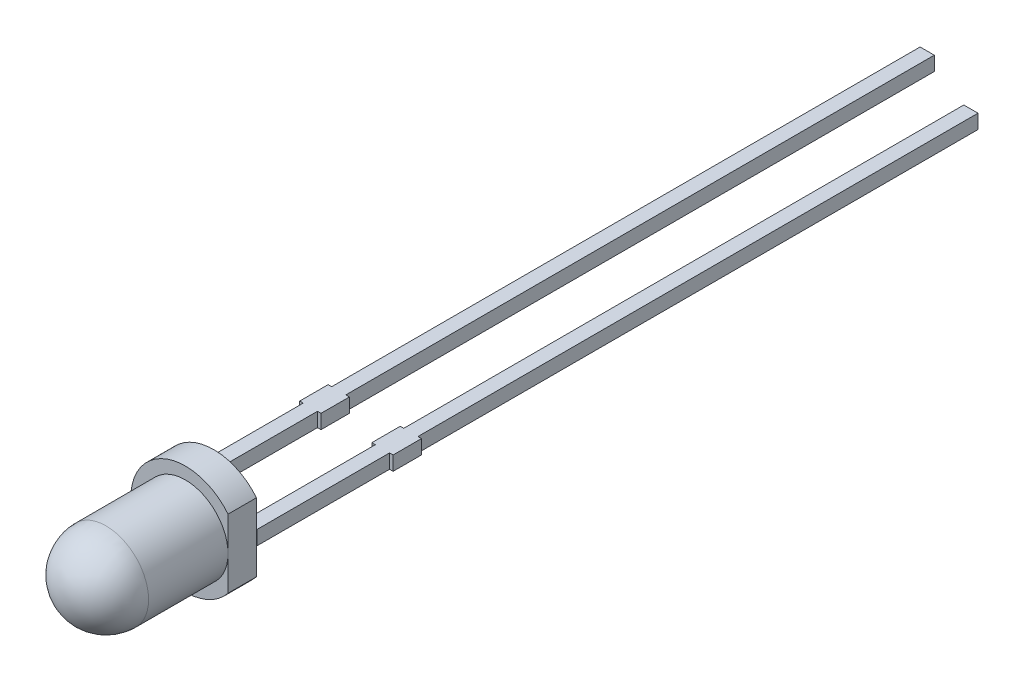
ISO-10303-21;
HEADER;
FILE_DESCRIPTION(('STEP AP214'),'2;1');
FILE_NAME('part.step','',(''),(''),'','','');
FILE_SCHEMA(('AUTOMOTIVE_DESIGN { 1 0 10303 214 1 1 1 1 }'));
ENDSEC;
DATA;
#1=APPLICATION_CONTEXT('core data for automotive mechanical design processes');
#2=APPLICATION_PROTOCOL_DEFINITION('international standard','automotive_design',2000,#1);
#3=PRODUCT_CONTEXT('',#1,'mechanical');
#4=PRODUCT('Part','Part','',(#3));
#5=PRODUCT_RELATED_PRODUCT_CATEGORY('part','',(#4));
#6=PRODUCT_DEFINITION_FORMATION('','',#4);
#7=PRODUCT_DEFINITION_CONTEXT('part definition',#1,'design');
#8=PRODUCT_DEFINITION('design','',#6,#7);
#9=PRODUCT_DEFINITION_SHAPE('','',#8);
#10=(LENGTH_UNIT() NAMED_UNIT(*) SI_UNIT(.MILLI.,.METRE.));
#11=(NAMED_UNIT(*) PLANE_ANGLE_UNIT() SI_UNIT($,.RADIAN.));
#12=(NAMED_UNIT(*) SI_UNIT($,.STERADIAN.) SOLID_ANGLE_UNIT());
#13=UNCERTAINTY_MEASURE_WITH_UNIT(LENGTH_MEASURE(1.E-05),#10,'distance_accuracy_value','');
#14=(GEOMETRIC_REPRESENTATION_CONTEXT(3) GLOBAL_UNCERTAINTY_ASSIGNED_CONTEXT((#13)) GLOBAL_UNIT_ASSIGNED_CONTEXT((#10,
#11,#12)) REPRESENTATION_CONTEXT('',''));
#15=CARTESIAN_POINT('',(0.,0.,0.));
#16=DIRECTION('',(0.,0.,1.));
#17=DIRECTION('',(1.,0.,0.));
#18=AXIS2_PLACEMENT_3D('',#15,#16,#17);
#19=CARTESIAN_POINT('',(-1.52,-0.25,-26.4));
#20=DIRECTION('',(0.,-1.,0.));
#21=DIRECTION('',(0.,0.,-1.));
#22=AXIS2_PLACEMENT_3D('',#19,#20,#21);
#23=PLANE('',#22);
#24=DIRECTION('',(0.,0.,-1.));
#25=VECTOR('',#24,1.);
#26=CARTESIAN_POINT('',(-1.02,-0.25,-26.4));
#27=LINE('',#26,#25);
#28=CARTESIAN_POINT('',(-1.02,-0.25,0.));
#29=VERTEX_POINT('',#28);
#30=CARTESIAN_POINT('',(-1.02,-0.25,-4.67));
#31=VERTEX_POINT('',#30);
#32=EDGE_CURVE('E238',#29,#31,#27,.T.);
#33=ORIENTED_EDGE('',*,*,#32,.F.);
#34=DIRECTION('',(1.,0.,0.));
#35=VECTOR('',#34,1.);
#36=CARTESIAN_POINT('',(-1.52,-0.25,0.));
#37=LINE('',#36,#35);
#38=CARTESIAN_POINT('',(-1.52,-0.25,0.));
#39=VERTEX_POINT('',#38);
#40=EDGE_CURVE('E220',#29,#39,#37,.F.);
#41=ORIENTED_EDGE('',*,*,#40,.T.);
#42=DIRECTION('',(0.,0.,1.));
#43=VECTOR('',#42,1.);
#44=CARTESIAN_POINT('',(-1.52,-0.25,-26.4));
#45=LINE('',#44,#43);
#46=CARTESIAN_POINT('',(-1.52,-0.25,-4.67));
#47=VERTEX_POINT('',#46);
#48=EDGE_CURVE('E404',#47,#39,#45,.T.);
#49=ORIENTED_EDGE('',*,*,#48,.F.);
#50=DIRECTION('',(-1.,0.,0.));
#51=VECTOR('',#50,1.);
#52=CARTESIAN_POINT('',(-0.895,-0.25,-4.67));
#53=LINE('',#52,#51);
#54=CARTESIAN_POINT('',(-1.645,-0.25,-4.67));
#55=VERTEX_POINT('',#54);
#56=EDGE_CURVE('E412',#47,#55,#53,.T.);
#57=ORIENTED_EDGE('',*,*,#56,.T.);
#58=DIRECTION('',(0.,0.,-1.));
#59=VECTOR('',#58,1.);
#60=CARTESIAN_POINT('',(-1.645,-0.25,-4.67));
#61=LINE('',#60,#59);
#62=CARTESIAN_POINT('',(-1.645,-0.25,-5.67));
#63=VERTEX_POINT('',#62);
#64=EDGE_CURVE('E416',#55,#63,#61,.T.);
#65=ORIENTED_EDGE('',*,*,#64,.T.);
#66=DIRECTION('',(1.,0.,0.));
#67=VECTOR('',#66,1.);
#68=CARTESIAN_POINT('',(-1.645,-0.25,-5.67));
#69=LINE('',#68,#67);
#70=CARTESIAN_POINT('',(-1.52,-0.25,-5.67));
#71=VERTEX_POINT('',#70);
#72=EDGE_CURVE('E420',#63,#71,#69,.T.);
#73=ORIENTED_EDGE('',*,*,#72,.T.);
#74=DIRECTION('',(0.,0.,1.));
#75=VECTOR('',#74,1.);
#76=CARTESIAN_POINT('',(-1.52,-0.25,-26.4));
#77=LINE('',#76,#75);
#78=CARTESIAN_POINT('',(-1.52,-0.25,-26.4));
#79=VERTEX_POINT('',#78);
#80=EDGE_CURVE('E425',#79,#71,#77,.T.);
#81=ORIENTED_EDGE('',*,*,#80,.F.);
#82=DIRECTION('',(1.,0.,0.));
#83=VECTOR('',#82,1.);
#84=CARTESIAN_POINT('',(-1.52,-0.25,-26.4));
#85=LINE('',#84,#83);
#86=CARTESIAN_POINT('',(-1.02,-0.25,-26.4));
#87=VERTEX_POINT('',#86);
#88=EDGE_CURVE('E430',#79,#87,#85,.T.);
#89=ORIENTED_EDGE('',*,*,#88,.T.);
#90=DIRECTION('',(0.,0.,-1.));
#91=VECTOR('',#90,1.);
#92=CARTESIAN_POINT('',(-1.02,-0.25,-26.4));
#93=LINE('',#92,#91);
#94=CARTESIAN_POINT('',(-1.02,-0.25,-5.67));
#95=VERTEX_POINT('',#94);
#96=EDGE_CURVE('E432',#95,#87,#93,.T.);
#97=ORIENTED_EDGE('',*,*,#96,.F.);
#98=DIRECTION('',(1.,0.,0.));
#99=VECTOR('',#98,1.);
#100=CARTESIAN_POINT('',(-1.645,-0.25,-5.67));
#101=LINE('',#100,#99);
#102=CARTESIAN_POINT('',(-0.895,-0.25,-5.67));
#103=VERTEX_POINT('',#102);
#104=EDGE_CURVE('E440',#95,#103,#101,.T.);
#105=ORIENTED_EDGE('',*,*,#104,.T.);
#106=DIRECTION('',(0.,0.,1.));
#107=VECTOR('',#106,1.);
#108=CARTESIAN_POINT('',(-0.895,-0.25,-5.67));
#109=LINE('',#108,#107);
#110=CARTESIAN_POINT('',(-0.895,-0.25,-4.67));
#111=VERTEX_POINT('',#110);
#112=EDGE_CURVE('E444',#103,#111,#109,.T.);
#113=ORIENTED_EDGE('',*,*,#112,.T.);
#114=DIRECTION('',(-1.,0.,0.));
#115=VECTOR('',#114,1.);
#116=CARTESIAN_POINT('',(-0.895,-0.25,-4.67));
#117=LINE('',#116,#115);
#118=EDGE_CURVE('E448',#111,#31,#117,.T.);
#119=ORIENTED_EDGE('',*,*,#118,.T.);
#120=EDGE_LOOP('',(#33,#41,#49,#57,#65,#73,#81,#89,#97,#105,#113,#119));
#121=FACE_BOUND('',#120,.T.);
#122=ADVANCED_FACE('F16',(#121),#23,.T.);
#123=CARTESIAN_POINT('',(1.52,-0.25,-26.4));
#124=DIRECTION('',(0.,1.,0.));
#125=DIRECTION('',(0.,0.,1.));
#126=AXIS2_PLACEMENT_3D('',#123,#124,#125);
#127=PLANE('',#126);
#128=DIRECTION('',(1.,0.,0.));
#129=VECTOR('',#128,1.);
#130=CARTESIAN_POINT('',(0.895,-0.25,-4.67));
#131=LINE('',#130,#129);
#132=CARTESIAN_POINT('',(0.895,-0.25,-4.67));
#133=VERTEX_POINT('',#132);
#134=CARTESIAN_POINT('',(1.02,-0.25,-4.67));
#135=VERTEX_POINT('',#134);
#136=EDGE_CURVE('E389',#133,#135,#131,.T.);
#137=ORIENTED_EDGE('',*,*,#136,.F.);
#138=DIRECTION('',(0.,0.,1.));
#139=VECTOR('',#138,1.);
#140=CARTESIAN_POINT('',(0.895,-0.25,-5.67));
#141=LINE('',#140,#139);
#142=CARTESIAN_POINT('',(0.895,-0.25,-5.67));
#143=VERTEX_POINT('',#142);
#144=EDGE_CURVE('E386',#143,#133,#141,.T.);
#145=ORIENTED_EDGE('',*,*,#144,.F.);
#146=DIRECTION('',(-1.,0.,0.));
#147=VECTOR('',#146,1.);
#148=CARTESIAN_POINT('',(1.645,-0.25,-5.67));
#149=LINE('',#148,#147);
#150=CARTESIAN_POINT('',(1.02,-0.25,-5.67));
#151=VERTEX_POINT('',#150);
#152=EDGE_CURVE('E380',#151,#143,#149,.T.);
#153=ORIENTED_EDGE('',*,*,#152,.F.);
#154=DIRECTION('',(0.,0.,-1.));
#155=VECTOR('',#154,1.);
#156=CARTESIAN_POINT('',(1.02,-0.25,-26.4));
#157=LINE('',#156,#155);
#158=CARTESIAN_POINT('',(1.02,-0.25,-25.4));
#159=VERTEX_POINT('',#158);
#160=EDGE_CURVE('E372',#151,#159,#157,.T.);
#161=ORIENTED_EDGE('',*,*,#160,.T.);
#162=DIRECTION('',(-1.,0.,0.));
#163=VECTOR('',#162,1.);
#164=CARTESIAN_POINT('',(1.52,-0.25,-25.4));
#165=LINE('',#164,#163);
#166=CARTESIAN_POINT('',(1.52,-0.25,-25.4));
#167=VERTEX_POINT('',#166);
#168=EDGE_CURVE('E369',#167,#159,#165,.T.);
#169=ORIENTED_EDGE('',*,*,#168,.F.);
#170=DIRECTION('',(0.,0.,1.));
#171=VECTOR('',#170,1.);
#172=CARTESIAN_POINT('',(1.52,-0.25,-26.4));
#173=LINE('',#172,#171);
#174=CARTESIAN_POINT('',(1.52,-0.25,-5.67));
#175=VERTEX_POINT('',#174);
#176=EDGE_CURVE('E361',#167,#175,#173,.T.);
#177=ORIENTED_EDGE('',*,*,#176,.T.);
#178=DIRECTION('',(-1.,0.,0.));
#179=VECTOR('',#178,1.);
#180=CARTESIAN_POINT('',(1.645,-0.25,-5.67));
#181=LINE('',#180,#179);
#182=CARTESIAN_POINT('',(1.645,-0.25,-5.67));
#183=VERTEX_POINT('',#182);
#184=EDGE_CURVE('E355',#183,#175,#181,.T.);
#185=ORIENTED_EDGE('',*,*,#184,.F.);
#186=DIRECTION('',(0.,0.,-1.));
#187=VECTOR('',#186,1.);
#188=CARTESIAN_POINT('',(1.645,-0.25,-4.67));
#189=LINE('',#188,#187);
#190=CARTESIAN_POINT('',(1.645,-0.25,-4.67));
#191=VERTEX_POINT('',#190);
#192=EDGE_CURVE('E352',#191,#183,#189,.T.);
#193=ORIENTED_EDGE('',*,*,#192,.F.);
#194=DIRECTION('',(1.,0.,0.));
#195=VECTOR('',#194,1.);
#196=CARTESIAN_POINT('',(0.895,-0.25,-4.67));
#197=LINE('',#196,#195);
#198=CARTESIAN_POINT('',(1.52,-0.25,-4.67));
#199=VERTEX_POINT('',#198);
#200=EDGE_CURVE('E346',#199,#191,#197,.T.);
#201=ORIENTED_EDGE('',*,*,#200,.F.);
#202=DIRECTION('',(0.,0.,1.));
#203=VECTOR('',#202,1.);
#204=CARTESIAN_POINT('',(1.52,-0.25,-26.4));
#205=LINE('',#204,#203);
#206=CARTESIAN_POINT('',(1.52,-0.25,0.));
#207=VERTEX_POINT('',#206);
#208=EDGE_CURVE('E237',#199,#207,#205,.T.);
#209=ORIENTED_EDGE('',*,*,#208,.T.);
#210=DIRECTION('',(1.,0.,0.));
#211=VECTOR('',#210,1.);
#212=CARTESIAN_POINT('',(1.52,-0.25,0.));
#213=LINE('',#212,#211);
#214=CARTESIAN_POINT('',(1.5,-0.25,0.));
#215=VERTEX_POINT('',#214);
#216=EDGE_CURVE('E219',#215,#207,#213,.T.);
#217=ORIENTED_EDGE('',*,*,#216,.F.);
#218=DIRECTION('',(1.,0.,0.));
#219=VECTOR('',#218,1.);
#220=CARTESIAN_POINT('',(1.52,-0.25,0.));
#221=LINE('',#220,#219);
#222=CARTESIAN_POINT('',(1.02,-0.25,0.));
#223=VERTEX_POINT('',#222);
#224=EDGE_CURVE('E207',#223,#215,#221,.T.);
#225=ORIENTED_EDGE('',*,*,#224,.F.);
#226=DIRECTION('',(0.,0.,-1.));
#227=VECTOR('',#226,1.);
#228=CARTESIAN_POINT('',(1.02,-0.25,-26.4));
#229=LINE('',#228,#227);
#230=EDGE_CURVE('E391',#223,#135,#229,.T.);
#231=ORIENTED_EDGE('',*,*,#230,.T.);
#232=EDGE_LOOP('',(#137,#145,#153,#161,#169,#177,#185,#193,#201,#209,#217,#225,#231));
#233=FACE_BOUND('',#232,.T.);
#234=ADVANCED_FACE('F235',(#233),#127,.F.);
#235=CARTESIAN_POINT('',(-1.02,-0.25,-26.4));
#236=DIRECTION('',(1.,0.,0.));
#237=DIRECTION('',(0.,0.,-1.));
#238=AXIS2_PLACEMENT_3D('',#235,#236,#237);
#239=PLANE('',#238);
#240=DIRECTION('',(0.,0.,1.));
#241=VECTOR('',#240,1.);
#242=CARTESIAN_POINT('',(-1.02,0.25,-26.4));
#243=LINE('',#242,#241);
#244=CARTESIAN_POINT('',(-1.02,0.25,0.));
#245=VERTEX_POINT('',#244);
#246=CARTESIAN_POINT('',(-1.02,0.25,-4.67));
#247=VERTEX_POINT('',#246);
#248=EDGE_CURVE('E249',#245,#247,#243,.F.);
#249=ORIENTED_EDGE('',*,*,#248,.F.);
#250=DIRECTION('',(0.,1.,0.));
#251=VECTOR('',#250,1.);
#252=CARTESIAN_POINT('',(-1.02,-0.25,0.));
#253=LINE('',#252,#251);
#254=EDGE_CURVE('E241',#245,#29,#253,.F.);
#255=ORIENTED_EDGE('',*,*,#254,.T.);
#256=ORIENTED_EDGE('',*,*,#32,.T.);
#257=DIRECTION('',(0.,1.,0.));
#258=VECTOR('',#257,1.);
#259=CARTESIAN_POINT('',(-1.02,-0.25,-4.67));
#260=LINE('',#259,#258);
#261=EDGE_CURVE('E446',#31,#247,#260,.T.);
#262=ORIENTED_EDGE('',*,*,#261,.T.);
#263=EDGE_LOOP('',(#249,#255,#256,#262));
#264=FACE_BOUND('',#263,.T.);
#265=ADVANCED_FACE('F777',(#264),#239,.T.);
#266=CARTESIAN_POINT('',(-0.895,-0.25,-4.67));
#267=DIRECTION('',(0.,0.,-1.));
#268=DIRECTION('',(-1.,0.,0.));
#269=AXIS2_PLACEMENT_3D('',#266,#267,#268);
#270=PLANE('',#269);
#271=ORIENTED_EDGE('',*,*,#118,.F.);
#272=DIRECTION('',(0.,1.,0.));
#273=VECTOR('',#272,1.);
#274=CARTESIAN_POINT('',(-0.895,-0.25,-4.67));
#275=LINE('',#274,#273);
#276=CARTESIAN_POINT('',(-0.895,0.25,-4.67));
#277=VERTEX_POINT('',#276);
#278=EDGE_CURVE('E442',#111,#277,#275,.T.);
#279=ORIENTED_EDGE('',*,*,#278,.T.);
#280=DIRECTION('',(1.,0.,0.));
#281=VECTOR('',#280,1.);
#282=CARTESIAN_POINT('',(-1.02,0.25,-4.67));
#283=LINE('',#282,#281);
#284=EDGE_CURVE('E337',#247,#277,#283,.T.);
#285=ORIENTED_EDGE('',*,*,#284,.F.);
#286=ORIENTED_EDGE('',*,*,#261,.F.);
#287=EDGE_LOOP('',(#271,#279,#285,#286));
#288=FACE_BOUND('',#287,.T.);
#289=ADVANCED_FACE('F768',(#288),#270,.F.);
#290=CARTESIAN_POINT('',(-0.895,-0.25,-5.67));
#291=DIRECTION('',(-1.,0.,0.));
#292=DIRECTION('',(0.,0.,1.));
#293=AXIS2_PLACEMENT_3D('',#290,#291,#292);
#294=PLANE('',#293);
#295=ORIENTED_EDGE('',*,*,#278,.F.);
#296=ORIENTED_EDGE('',*,*,#112,.F.);
#297=DIRECTION('',(0.,1.,0.));
#298=VECTOR('',#297,1.);
#299=CARTESIAN_POINT('',(-0.895,-0.25,-5.67));
#300=LINE('',#299,#298);
#301=CARTESIAN_POINT('',(-0.895,0.25,-5.67));
#302=VERTEX_POINT('',#301);
#303=EDGE_CURVE('E438',#103,#302,#300,.T.);
#304=ORIENTED_EDGE('',*,*,#303,.T.);
#305=DIRECTION('',(0.,0.,1.));
#306=VECTOR('',#305,1.);
#307=CARTESIAN_POINT('',(-0.895,0.25,-26.4));
#308=LINE('',#307,#306);
#309=EDGE_CURVE('E334',#277,#302,#308,.F.);
#310=ORIENTED_EDGE('',*,*,#309,.F.);
#311=EDGE_LOOP('',(#295,#296,#304,#310));
#312=FACE_BOUND('',#311,.T.);
#313=ADVANCED_FACE('F759',(#312),#294,.F.);
#314=CARTESIAN_POINT('',(-1.645,-0.25,-5.67));
#315=DIRECTION('',(0.,0.,1.));
#316=DIRECTION('',(1.,0.,0.));
#317=AXIS2_PLACEMENT_3D('',#314,#315,#316);
#318=PLANE('',#317);
#319=DIRECTION('',(1.,0.,0.));
#320=VECTOR('',#319,1.);
#321=CARTESIAN_POINT('',(-1.02,0.25,-5.67));
#322=LINE('',#321,#320);
#323=CARTESIAN_POINT('',(-1.02,0.25,-5.67));
#324=VERTEX_POINT('',#323);
#325=EDGE_CURVE('E331',#302,#324,#322,.F.);
#326=ORIENTED_EDGE('',*,*,#325,.F.);
#327=ORIENTED_EDGE('',*,*,#303,.F.);
#328=ORIENTED_EDGE('',*,*,#104,.F.);
#329=DIRECTION('',(0.,1.,0.));
#330=VECTOR('',#329,1.);
#331=CARTESIAN_POINT('',(-1.02,-0.25,-5.67));
#332=LINE('',#331,#330);
#333=EDGE_CURVE('E435',#324,#95,#332,.F.);
#334=ORIENTED_EDGE('',*,*,#333,.F.);
#335=EDGE_LOOP('',(#326,#327,#328,#334));
#336=FACE_BOUND('',#335,.T.);
#337=ADVANCED_FACE('F750',(#336),#318,.F.);
#338=CARTESIAN_POINT('',(-1.02,-0.25,-26.4));
#339=DIRECTION('',(1.,0.,0.));
#340=DIRECTION('',(0.,0.,-1.));
#341=AXIS2_PLACEMENT_3D('',#338,#339,#340);
#342=PLANE('',#341);
#343=ORIENTED_EDGE('',*,*,#96,.T.);
#344=DIRECTION('',(0.,1.,0.));
#345=VECTOR('',#344,1.);
#346=CARTESIAN_POINT('',(-1.02,-0.25,-26.4));
#347=LINE('',#346,#345);
#348=CARTESIAN_POINT('',(-1.02,0.25,-26.4));
#349=VERTEX_POINT('',#348);
#350=EDGE_CURVE('E428',#87,#349,#347,.T.);
#351=ORIENTED_EDGE('',*,*,#350,.T.);
#352=DIRECTION('',(0.,0.,1.));
#353=VECTOR('',#352,1.);
#354=CARTESIAN_POINT('',(-1.02,0.25,-26.4));
#355=LINE('',#354,#353);
#356=EDGE_CURVE('E328',#324,#349,#355,.F.);
#357=ORIENTED_EDGE('',*,*,#356,.F.);
#358=ORIENTED_EDGE('',*,*,#333,.T.);
#359=EDGE_LOOP('',(#343,#351,#357,#358));
#360=FACE_BOUND('',#359,.T.);
#361=ADVANCED_FACE('F741',(#360),#342,.T.);
#362=CARTESIAN_POINT('',(-1.52,-0.25,-26.4));
#363=DIRECTION('',(0.,0.,1.));
#364=DIRECTION('',(1.,0.,0.));
#365=AXIS2_PLACEMENT_3D('',#362,#363,#364);
#366=PLANE('',#365);
#367=DIRECTION('',(1.,0.,0.));
#368=VECTOR('',#367,1.);
#369=CARTESIAN_POINT('',(-1.02,0.25,-26.4));
#370=LINE('',#369,#368);
#371=CARTESIAN_POINT('',(-1.52,0.25,-26.4));
#372=VERTEX_POINT('',#371);
#373=EDGE_CURVE('E325',#349,#372,#370,.F.);
#374=ORIENTED_EDGE('',*,*,#373,.F.);
#375=ORIENTED_EDGE('',*,*,#350,.F.);
#376=ORIENTED_EDGE('',*,*,#88,.F.);
#377=DIRECTION('',(0.,1.,0.));
#378=VECTOR('',#377,1.);
#379=CARTESIAN_POINT('',(-1.52,0.25,-26.4));
#380=LINE('',#379,#378);
#381=EDGE_CURVE('E422',#372,#79,#380,.F.);
#382=ORIENTED_EDGE('',*,*,#381,.F.);
#383=EDGE_LOOP('',(#374,#375,#376,#382));
#384=FACE_BOUND('',#383,.T.);
#385=ADVANCED_FACE('F732',(#384),#366,.F.);
#386=CARTESIAN_POINT('',(-1.52,0.25,-26.4));
#387=DIRECTION('',(-1.,0.,0.));
#388=DIRECTION('',(0.,0.,1.));
#389=AXIS2_PLACEMENT_3D('',#386,#387,#388);
#390=PLANE('',#389);
#391=DIRECTION('',(0.,0.,1.));
#392=VECTOR('',#391,1.);
#393=CARTESIAN_POINT('',(-1.52,0.25,-26.4));
#394=LINE('',#393,#392);
#395=CARTESIAN_POINT('',(-1.52,0.25,-5.67));
#396=VERTEX_POINT('',#395);
#397=EDGE_CURVE('E322',#372,#396,#394,.T.);
#398=ORIENTED_EDGE('',*,*,#397,.F.);
#399=ORIENTED_EDGE('',*,*,#381,.T.);
#400=ORIENTED_EDGE('',*,*,#80,.T.);
#401=DIRECTION('',(0.,1.,0.));
#402=VECTOR('',#401,1.);
#403=CARTESIAN_POINT('',(-1.52,-0.25,-5.67));
#404=LINE('',#403,#402);
#405=EDGE_CURVE('E418',#71,#396,#404,.T.);
#406=ORIENTED_EDGE('',*,*,#405,.T.);
#407=EDGE_LOOP('',(#398,#399,#400,#406));
#408=FACE_BOUND('',#407,.T.);
#409=ADVANCED_FACE('F723',(#408),#390,.T.);
#410=CARTESIAN_POINT('',(-1.645,-0.25,-5.67));
#411=DIRECTION('',(0.,0.,1.));
#412=DIRECTION('',(1.,0.,0.));
#413=AXIS2_PLACEMENT_3D('',#410,#411,#412);
#414=PLANE('',#413);
#415=ORIENTED_EDGE('',*,*,#72,.F.);
#416=DIRECTION('',(0.,1.,0.));
#417=VECTOR('',#416,1.);
#418=CARTESIAN_POINT('',(-1.645,-0.25,-5.67));
#419=LINE('',#418,#417);
#420=CARTESIAN_POINT('',(-1.645,0.25,-5.67));
#421=VERTEX_POINT('',#420);
#422=EDGE_CURVE('E414',#63,#421,#419,.T.);
#423=ORIENTED_EDGE('',*,*,#422,.T.);
#424=DIRECTION('',(1.,0.,0.));
#425=VECTOR('',#424,1.);
#426=CARTESIAN_POINT('',(-1.02,0.25,-5.67));
#427=LINE('',#426,#425);
#428=EDGE_CURVE('E319',#396,#421,#427,.F.);
#429=ORIENTED_EDGE('',*,*,#428,.F.);
#430=ORIENTED_EDGE('',*,*,#405,.F.);
#431=EDGE_LOOP('',(#415,#423,#429,#430));
#432=FACE_BOUND('',#431,.T.);
#433=ADVANCED_FACE('F714',(#432),#414,.F.);
#434=CARTESIAN_POINT('',(-1.645,-0.25,-4.67));
#435=DIRECTION('',(1.,0.,0.));
#436=DIRECTION('',(0.,0.,-1.));
#437=AXIS2_PLACEMENT_3D('',#434,#435,#436);
#438=PLANE('',#437);
#439=ORIENTED_EDGE('',*,*,#422,.F.);
#440=ORIENTED_EDGE('',*,*,#64,.F.);
#441=DIRECTION('',(0.,1.,0.));
#442=VECTOR('',#441,1.);
#443=CARTESIAN_POINT('',(-1.645,-0.25,-4.67));
#444=LINE('',#443,#442);
#445=CARTESIAN_POINT('',(-1.645,0.25,-4.67));
#446=VERTEX_POINT('',#445);
#447=EDGE_CURVE('E410',#55,#446,#444,.T.);
#448=ORIENTED_EDGE('',*,*,#447,.T.);
#449=DIRECTION('',(0.,0.,1.));
#450=VECTOR('',#449,1.);
#451=CARTESIAN_POINT('',(-1.645,0.25,-26.4));
#452=LINE('',#451,#450);
#453=EDGE_CURVE('E316',#421,#446,#452,.T.);
#454=ORIENTED_EDGE('',*,*,#453,.F.);
#455=EDGE_LOOP('',(#439,#440,#448,#454));
#456=FACE_BOUND('',#455,.T.);
#457=ADVANCED_FACE('F705',(#456),#438,.F.);
#458=CARTESIAN_POINT('',(-0.895,-0.25,-4.67));
#459=DIRECTION('',(0.,0.,-1.));
#460=DIRECTION('',(-1.,0.,0.));
#461=AXIS2_PLACEMENT_3D('',#458,#459,#460);
#462=PLANE('',#461);
#463=DIRECTION('',(1.,0.,0.));
#464=VECTOR('',#463,1.);
#465=CARTESIAN_POINT('',(-1.02,0.25,-4.67));
#466=LINE('',#465,#464);
#467=CARTESIAN_POINT('',(-1.52,0.25,-4.67));
#468=VERTEX_POINT('',#467);
#469=EDGE_CURVE('E313',#446,#468,#466,.T.);
#470=ORIENTED_EDGE('',*,*,#469,.F.);
#471=ORIENTED_EDGE('',*,*,#447,.F.);
#472=ORIENTED_EDGE('',*,*,#56,.F.);
#473=DIRECTION('',(0.,1.,0.));
#474=VECTOR('',#473,1.);
#475=CARTESIAN_POINT('',(-1.52,0.25,-4.67));
#476=LINE('',#475,#474);
#477=EDGE_CURVE('E407',#468,#47,#476,.F.);
#478=ORIENTED_EDGE('',*,*,#477,.F.);
#479=EDGE_LOOP('',(#470,#471,#472,#478));
#480=FACE_BOUND('',#479,.T.);
#481=ADVANCED_FACE('F696',(#480),#462,.F.);
#482=CARTESIAN_POINT('',(-1.52,0.25,-26.4));
#483=DIRECTION('',(-1.,0.,0.));
#484=DIRECTION('',(0.,0.,1.));
#485=AXIS2_PLACEMENT_3D('',#482,#483,#484);
#486=PLANE('',#485);
#487=ORIENTED_EDGE('',*,*,#48,.T.);
#488=DIRECTION('',(0.,1.,0.));
#489=VECTOR('',#488,1.);
#490=CARTESIAN_POINT('',(-1.52,0.25,0.));
#491=LINE('',#490,#489);
#492=CARTESIAN_POINT('',(-1.52,0.25,0.));
#493=VERTEX_POINT('',#492);
#494=EDGE_CURVE('E392',#39,#493,#491,.T.);
#495=ORIENTED_EDGE('',*,*,#494,.T.);
#496=DIRECTION('',(0.,0.,1.));
#497=VECTOR('',#496,1.);
#498=CARTESIAN_POINT('',(-1.52,0.25,-26.4));
#499=LINE('',#498,#497);
#500=EDGE_CURVE('E308',#468,#493,#499,.T.);
#501=ORIENTED_EDGE('',*,*,#500,.F.);
#502=ORIENTED_EDGE('',*,*,#477,.T.);
#503=EDGE_LOOP('',(#487,#495,#501,#502));
#504=FACE_BOUND('',#503,.T.);
#505=ADVANCED_FACE('F688',(#504),#486,.T.);
#506=CARTESIAN_POINT('',(1.02,-0.25,-26.4));
#507=DIRECTION('',(1.,0.,0.));
#508=DIRECTION('',(0.,0.,-1.));
#509=AXIS2_PLACEMENT_3D('',#506,#507,#508);
#510=PLANE('',#509);
#511=DIRECTION('',(0.,1.,0.));
#512=VECTOR('',#511,1.);
#513=CARTESIAN_POINT('',(1.02,-0.25,-4.67));
#514=LINE('',#513,#512);
#515=CARTESIAN_POINT('',(1.02,0.25,-4.67));
#516=VERTEX_POINT('',#515);
#517=EDGE_CURVE('E395',#135,#516,#514,.T.);
#518=ORIENTED_EDGE('',*,*,#517,.F.);
#519=ORIENTED_EDGE('',*,*,#230,.F.);
#520=DIRECTION('',(0.,1.,0.));
#521=VECTOR('',#520,1.);
#522=CARTESIAN_POINT('',(1.02,-0.25,0.));
#523=LINE('',#522,#521);
#524=CARTESIAN_POINT('',(1.02,0.25,0.));
#525=VERTEX_POINT('',#524);
#526=EDGE_CURVE('E215',#525,#223,#523,.F.);
#527=ORIENTED_EDGE('',*,*,#526,.F.);
#528=DIRECTION('',(0.,0.,-1.));
#529=VECTOR('',#528,1.);
#530=CARTESIAN_POINT('',(1.02,0.25,-26.4));
#531=LINE('',#530,#529);
#532=EDGE_CURVE('E306',#525,#516,#531,.T.);
#533=ORIENTED_EDGE('',*,*,#532,.T.);
#534=EDGE_LOOP('',(#518,#519,#527,#533));
#535=FACE_BOUND('',#534,.T.);
#536=ADVANCED_FACE('F466',(#535),#510,.F.);
#537=CARTESIAN_POINT('',(0.895,-0.25,-4.67));
#538=DIRECTION('',(0.,0.,1.));
#539=DIRECTION('',(1.,0.,0.));
#540=AXIS2_PLACEMENT_3D('',#537,#538,#539);
#541=PLANE('',#540);
#542=DIRECTION('',(0.,1.,0.));
#543=VECTOR('',#542,1.);
#544=CARTESIAN_POINT('',(0.895,-0.25,-4.67));
#545=LINE('',#544,#543);
#546=CARTESIAN_POINT('',(0.895,0.25,-4.67));
#547=VERTEX_POINT('',#546);
#548=EDGE_CURVE('E383',#133,#547,#545,.T.);
#549=ORIENTED_EDGE('',*,*,#548,.F.);
#550=ORIENTED_EDGE('',*,*,#136,.T.);
#551=ORIENTED_EDGE('',*,*,#517,.T.);
#552=DIRECTION('',(1.,0.,0.));
#553=VECTOR('',#552,1.);
#554=CARTESIAN_POINT('',(1.02,0.25,-4.67));
#555=LINE('',#554,#553);
#556=EDGE_CURVE('E296',#516,#547,#555,.F.);
#557=ORIENTED_EDGE('',*,*,#556,.T.);
#558=EDGE_LOOP('',(#549,#550,#551,#557));
#559=FACE_BOUND('',#558,.T.);
#560=ADVANCED_FACE('F461',(#559),#541,.T.);
#561=CARTESIAN_POINT('',(0.895,-0.25,-5.67));
#562=DIRECTION('',(-1.,0.,0.));
#563=DIRECTION('',(0.,0.,1.));
#564=AXIS2_PLACEMENT_3D('',#561,#562,#563);
#565=PLANE('',#564);
#566=ORIENTED_EDGE('',*,*,#144,.T.);
#567=ORIENTED_EDGE('',*,*,#548,.T.);
#568=DIRECTION('',(0.,0.,-1.));
#569=VECTOR('',#568,1.);
#570=CARTESIAN_POINT('',(0.895,0.25,-26.4));
#571=LINE('',#570,#569);
#572=CARTESIAN_POINT('',(0.895,0.25,-5.67));
#573=VERTEX_POINT('',#572);
#574=EDGE_CURVE('E295',#547,#573,#571,.T.);
#575=ORIENTED_EDGE('',*,*,#574,.T.);
#576=DIRECTION('',(0.,1.,0.));
#577=VECTOR('',#576,1.);
#578=CARTESIAN_POINT('',(0.895,-0.25,-5.67));
#579=LINE('',#578,#577);
#580=EDGE_CURVE('E377',#143,#573,#579,.T.);
#581=ORIENTED_EDGE('',*,*,#580,.F.);
#582=EDGE_LOOP('',(#566,#567,#575,#581));
#583=FACE_BOUND('',#582,.T.);
#584=ADVANCED_FACE('F474',(#583),#565,.T.);
#585=CARTESIAN_POINT('',(1.645,-0.25,-5.67));
#586=DIRECTION('',(0.,0.,-1.));
#587=DIRECTION('',(-1.,0.,0.));
#588=AXIS2_PLACEMENT_3D('',#585,#586,#587);
#589=PLANE('',#588);
#590=ORIENTED_EDGE('',*,*,#580,.T.);
#591=DIRECTION('',(1.,0.,0.));
#592=VECTOR('',#591,1.);
#593=CARTESIAN_POINT('',(1.02,0.25,-5.67));
#594=LINE('',#593,#592);
#595=CARTESIAN_POINT('',(1.02,0.25,-5.67));
#596=VERTEX_POINT('',#595);
#597=EDGE_CURVE('E293',#573,#596,#594,.T.);
#598=ORIENTED_EDGE('',*,*,#597,.T.);
#599=DIRECTION('',(0.,1.,0.));
#600=VECTOR('',#599,1.);
#601=CARTESIAN_POINT('',(1.02,-0.25,-5.67));
#602=LINE('',#601,#600);
#603=EDGE_CURVE('E374',#596,#151,#602,.F.);
#604=ORIENTED_EDGE('',*,*,#603,.T.);
#605=ORIENTED_EDGE('',*,*,#152,.T.);
#606=EDGE_LOOP('',(#590,#598,#604,#605));
#607=FACE_BOUND('',#606,.T.);
#608=ADVANCED_FACE('F476',(#607),#589,.T.);
#609=CARTESIAN_POINT('',(1.02,-0.25,-26.4));
#610=DIRECTION('',(1.,0.,0.));
#611=DIRECTION('',(0.,0.,-1.));
#612=AXIS2_PLACEMENT_3D('',#609,#610,#611);
#613=PLANE('',#612);
#614=ORIENTED_EDGE('',*,*,#603,.F.);
#615=DIRECTION('',(0.,0.,-1.));
#616=VECTOR('',#615,1.);
#617=CARTESIAN_POINT('',(1.02,0.25,-26.4));
#618=LINE('',#617,#616);
#619=CARTESIAN_POINT('',(1.02,0.25,-25.4));
#620=VERTEX_POINT('',#619);
#621=EDGE_CURVE('E291',#596,#620,#618,.T.);
#622=ORIENTED_EDGE('',*,*,#621,.T.);
#623=DIRECTION('',(0.,1.,0.));
#624=VECTOR('',#623,1.);
#625=CARTESIAN_POINT('',(1.02,-32.1182273016429,-25.4));
#626=LINE('',#625,#624);
#627=EDGE_CURVE('E366',#159,#620,#626,.T.);
#628=ORIENTED_EDGE('',*,*,#627,.F.);
#629=ORIENTED_EDGE('',*,*,#160,.F.);
#630=EDGE_LOOP('',(#614,#622,#628,#629));
#631=FACE_BOUND('',#630,.T.);
#632=ADVANCED_FACE('F481',(#631),#613,.F.);
#633=CARTESIAN_POINT('',(1.52,-32.1182273016429,-25.4));
#634=DIRECTION('',(0.,0.,-1.));
#635=DIRECTION('',(-1.,0.,0.));
#636=AXIS2_PLACEMENT_3D('',#633,#634,#635);
#637=PLANE('',#636);
#638=DIRECTION('',(1.,0.,0.));
#639=VECTOR('',#638,1.);
#640=CARTESIAN_POINT('',(1.02,0.25,-25.4));
#641=LINE('',#640,#639);
#642=CARTESIAN_POINT('',(1.52,0.25,-25.4));
#643=VERTEX_POINT('',#642);
#644=EDGE_CURVE('E289',#620,#643,#641,.T.);
#645=ORIENTED_EDGE('',*,*,#644,.T.);
#646=DIRECTION('',(0.,1.,0.));
#647=VECTOR('',#646,1.);
#648=CARTESIAN_POINT('',(1.52,0.25,-25.4));
#649=LINE('',#648,#647);
#650=EDGE_CURVE('E363',#643,#167,#649,.F.);
#651=ORIENTED_EDGE('',*,*,#650,.T.);
#652=ORIENTED_EDGE('',*,*,#168,.T.);
#653=ORIENTED_EDGE('',*,*,#627,.T.);
#654=EDGE_LOOP('',(#645,#651,#652,#653));
#655=FACE_BOUND('',#654,.T.);
#656=ADVANCED_FACE('F485',(#655),#637,.T.);
#657=CARTESIAN_POINT('',(1.52,0.25,-26.4));
#658=DIRECTION('',(-1.,0.,0.));
#659=DIRECTION('',(0.,0.,1.));
#660=AXIS2_PLACEMENT_3D('',#657,#658,#659);
#661=PLANE('',#660);
#662=DIRECTION('',(0.,1.,0.));
#663=VECTOR('',#662,1.);
#664=CARTESIAN_POINT('',(1.52,-0.25,-5.67));
#665=LINE('',#664,#663);
#666=CARTESIAN_POINT('',(1.52,0.25,-5.67));
#667=VERTEX_POINT('',#666);
#668=EDGE_CURVE('E358',#175,#667,#665,.T.);
#669=ORIENTED_EDGE('',*,*,#668,.F.);
#670=ORIENTED_EDGE('',*,*,#176,.F.);
#671=ORIENTED_EDGE('',*,*,#650,.F.);
#672=DIRECTION('',(0.,0.,-1.));
#673=VECTOR('',#672,1.);
#674=CARTESIAN_POINT('',(1.52,0.25,-26.4));
#675=LINE('',#674,#673);
#676=EDGE_CURVE('E287',#643,#667,#675,.F.);
#677=ORIENTED_EDGE('',*,*,#676,.T.);
#678=EDGE_LOOP('',(#669,#670,#671,#677));
#679=FACE_BOUND('',#678,.T.);
#680=ADVANCED_FACE('F491',(#679),#661,.F.);
#681=CARTESIAN_POINT('',(1.645,-0.25,-5.67));
#682=DIRECTION('',(0.,0.,-1.));
#683=DIRECTION('',(-1.,0.,0.));
#684=AXIS2_PLACEMENT_3D('',#681,#682,#683);
#685=PLANE('',#684);
#686=DIRECTION('',(0.,1.,0.));
#687=VECTOR('',#686,1.);
#688=CARTESIAN_POINT('',(1.645,-0.25,-5.67));
#689=LINE('',#688,#687);
#690=CARTESIAN_POINT('',(1.645,0.25,-5.67));
#691=VERTEX_POINT('',#690);
#692=EDGE_CURVE('E349',#183,#691,#689,.T.);
#693=ORIENTED_EDGE('',*,*,#692,.F.);
#694=ORIENTED_EDGE('',*,*,#184,.T.);
#695=ORIENTED_EDGE('',*,*,#668,.T.);
#696=DIRECTION('',(1.,0.,0.));
#697=VECTOR('',#696,1.);
#698=CARTESIAN_POINT('',(1.02,0.25,-5.67));
#699=LINE('',#698,#697);
#700=EDGE_CURVE('E285',#667,#691,#699,.T.);
#701=ORIENTED_EDGE('',*,*,#700,.T.);
#702=EDGE_LOOP('',(#693,#694,#695,#701));
#703=FACE_BOUND('',#702,.T.);
#704=ADVANCED_FACE('F495',(#703),#685,.T.);
#705=CARTESIAN_POINT('',(1.645,-0.25,-4.67));
#706=DIRECTION('',(1.,0.,0.));
#707=DIRECTION('',(0.,0.,-1.));
#708=AXIS2_PLACEMENT_3D('',#705,#706,#707);
#709=PLANE('',#708);
#710=ORIENTED_EDGE('',*,*,#192,.T.);
#711=ORIENTED_EDGE('',*,*,#692,.T.);
#712=DIRECTION('',(0.,0.,-1.));
#713=VECTOR('',#712,1.);
#714=CARTESIAN_POINT('',(1.645,0.25,-26.4));
#715=LINE('',#714,#713);
#716=CARTESIAN_POINT('',(1.645,0.25,-4.67));
#717=VERTEX_POINT('',#716);
#718=EDGE_CURVE('E283',#691,#717,#715,.F.);
#719=ORIENTED_EDGE('',*,*,#718,.T.);
#720=DIRECTION('',(0.,1.,0.));
#721=VECTOR('',#720,1.);
#722=CARTESIAN_POINT('',(1.645,-0.25,-4.67));
#723=LINE('',#722,#721);
#724=EDGE_CURVE('E254',#191,#717,#723,.T.);
#725=ORIENTED_EDGE('',*,*,#724,.F.);
#726=EDGE_LOOP('',(#710,#711,#719,#725));
#727=FACE_BOUND('',#726,.T.);
#728=ADVANCED_FACE('F499',(#727),#709,.T.);
#729=CARTESIAN_POINT('',(0.895,-0.25,-4.67));
#730=DIRECTION('',(0.,0.,1.));
#731=DIRECTION('',(1.,0.,0.));
#732=AXIS2_PLACEMENT_3D('',#729,#730,#731);
#733=PLANE('',#732);
#734=ORIENTED_EDGE('',*,*,#724,.T.);
#735=DIRECTION('',(1.,0.,0.));
#736=VECTOR('',#735,1.);
#737=CARTESIAN_POINT('',(1.02,0.25,-4.67));
#738=LINE('',#737,#736);
#739=CARTESIAN_POINT('',(1.52,0.25,-4.67));
#740=VERTEX_POINT('',#739);
#741=EDGE_CURVE('E281',#717,#740,#738,.F.);
#742=ORIENTED_EDGE('',*,*,#741,.T.);
#743=DIRECTION('',(0.,1.,0.));
#744=VECTOR('',#743,1.);
#745=CARTESIAN_POINT('',(1.52,0.25,-4.67));
#746=LINE('',#745,#744);
#747=EDGE_CURVE('E250',#740,#199,#746,.F.);
#748=ORIENTED_EDGE('',*,*,#747,.T.);
#749=ORIENTED_EDGE('',*,*,#200,.T.);
#750=EDGE_LOOP('',(#734,#742,#748,#749));
#751=FACE_BOUND('',#750,.T.);
#752=ADVANCED_FACE('F501',(#751),#733,.T.);
#753=CARTESIAN_POINT('',(1.52,0.25,-26.4));
#754=DIRECTION('',(-1.,0.,0.));
#755=DIRECTION('',(0.,0.,1.));
#756=AXIS2_PLACEMENT_3D('',#753,#754,#755);
#757=PLANE('',#756);
#758=ORIENTED_EDGE('',*,*,#747,.F.);
#759=DIRECTION('',(0.,0.,-1.));
#760=VECTOR('',#759,1.);
#761=CARTESIAN_POINT('',(1.52,0.25,-26.4));
#762=LINE('',#761,#760);
#763=CARTESIAN_POINT('',(1.52,0.25,0.));
#764=VERTEX_POINT('',#763);
#765=EDGE_CURVE('E279',#740,#764,#762,.F.);
#766=ORIENTED_EDGE('',*,*,#765,.T.);
#767=DIRECTION('',(0.,1.,0.));
#768=VECTOR('',#767,1.);
#769=CARTESIAN_POINT('',(1.52,0.25,0.));
#770=LINE('',#769,#768);
#771=EDGE_CURVE('E61',#207,#764,#770,.T.);
#772=ORIENTED_EDGE('',*,*,#771,.F.);
#773=ORIENTED_EDGE('',*,*,#208,.F.);
#774=EDGE_LOOP('',(#758,#766,#772,#773));
#775=FACE_BOUND('',#774,.T.);
#776=ADVANCED_FACE('F505',(#775),#757,.F.);
#777=CARTESIAN_POINT('',(-1.02,0.25,-26.4));
#778=DIRECTION('',(0.,1.,0.));
#779=DIRECTION('',(0.,0.,1.));
#780=AXIS2_PLACEMENT_3D('',#777,#778,#779);
#781=PLANE('',#780);
#782=ORIENTED_EDGE('',*,*,#500,.T.);
#783=DIRECTION('',(-1.,0.,0.));
#784=VECTOR('',#783,1.);
#785=CARTESIAN_POINT('',(0.,0.25,0.));
#786=LINE('',#785,#784);
#787=EDGE_CURVE('E276',#245,#493,#786,.T.);
#788=ORIENTED_EDGE('',*,*,#787,.F.);
#789=ORIENTED_EDGE('',*,*,#248,.T.);
#790=ORIENTED_EDGE('',*,*,#284,.T.);
#791=ORIENTED_EDGE('',*,*,#309,.T.);
#792=ORIENTED_EDGE('',*,*,#325,.T.);
#793=ORIENTED_EDGE('',*,*,#356,.T.);
#794=ORIENTED_EDGE('',*,*,#373,.T.);
#795=ORIENTED_EDGE('',*,*,#397,.T.);
#796=ORIENTED_EDGE('',*,*,#428,.T.);
#797=ORIENTED_EDGE('',*,*,#453,.T.);
#798=ORIENTED_EDGE('',*,*,#469,.T.);
#799=EDGE_LOOP('',(#782,#788,#789,#790,#791,#792,#793,#794,#795,#796,#797,#798));
#800=FACE_BOUND('',#799,.T.);
#801=ADVANCED_FACE('F507',(#800),#781,.T.);
#802=CARTESIAN_POINT('',(1.02,0.25,-26.4));
#803=DIRECTION('',(0.,-1.,0.));
#804=DIRECTION('',(0.,0.,-1.));
#805=AXIS2_PLACEMENT_3D('',#802,#803,#804);
#806=PLANE('',#805);
#807=ORIENTED_EDGE('',*,*,#741,.F.);
#808=ORIENTED_EDGE('',*,*,#718,.F.);
#809=ORIENTED_EDGE('',*,*,#700,.F.);
#810=ORIENTED_EDGE('',*,*,#676,.F.);
#811=ORIENTED_EDGE('',*,*,#644,.F.);
#812=ORIENTED_EDGE('',*,*,#621,.F.);
#813=ORIENTED_EDGE('',*,*,#597,.F.);
#814=ORIENTED_EDGE('',*,*,#574,.F.);
#815=ORIENTED_EDGE('',*,*,#556,.F.);
#816=ORIENTED_EDGE('',*,*,#532,.F.);
#817=DIRECTION('',(-1.,0.,0.));
#818=VECTOR('',#817,1.);
#819=CARTESIAN_POINT('',(0.,0.25,0.));
#820=LINE('',#819,#818);
#821=CARTESIAN_POINT('',(1.5,0.25,0.));
#822=VERTEX_POINT('',#821);
#823=EDGE_CURVE('E233',#822,#525,#820,.T.);
#824=ORIENTED_EDGE('',*,*,#823,.F.);
#825=DIRECTION('',(-1.,0.,0.));
#826=VECTOR('',#825,1.);
#827=CARTESIAN_POINT('',(1.52,0.25,0.));
#828=LINE('',#827,#826);
#829=EDGE_CURVE('E226',#822,#764,#828,.F.);
#830=ORIENTED_EDGE('',*,*,#829,.T.);
#831=ORIENTED_EDGE('',*,*,#765,.F.);
#832=EDGE_LOOP('',(#807,#808,#809,#810,#811,#812,#813,#814,#815,#816,#824,#830,#831));
#833=FACE_BOUND('',#832,.T.);
#834=ADVANCED_FACE('F470',(#833),#806,.F.);
#835=CARTESIAN_POINT('',(0.,0.,0.));
#836=DIRECTION('',(0.,0.,-1.));
#837=DIRECTION('',(-1.,0.,0.));
#838=AXIS2_PLACEMENT_3D('',#835,#836,#837);
#839=PLANE('',#838);
#840=CARTESIAN_POINT('',(0.,0.,0.));
#841=DIRECTION('',(0.,0.,1.));
#842=DIRECTION('',(1.,0.,0.));
#843=AXIS2_PLACEMENT_3D('',#840,#841,#842);
#844=CIRCLE('',#843,1.925);
#845=CARTESIAN_POINT('',(1.5,1.20649285120137,0.));
#846=VERTEX_POINT('',#845);
#847=CARTESIAN_POINT('',(1.5,-1.20649285120137,0.));
#848=VERTEX_POINT('',#847);
#849=EDGE_CURVE('E19',#846,#848,#844,.T.);
#850=ORIENTED_EDGE('',*,*,#849,.F.);
#851=DIRECTION('',(0.,1.,0.));
#852=VECTOR('',#851,1.);
#853=CARTESIAN_POINT('',(1.5,0.,0.));
#854=LINE('',#853,#852);
#855=EDGE_CURVE('E51',#846,#822,#854,.F.);
#856=ORIENTED_EDGE('',*,*,#855,.T.);
#857=ORIENTED_EDGE('',*,*,#823,.T.);
#858=ORIENTED_EDGE('',*,*,#526,.T.);
#859=ORIENTED_EDGE('',*,*,#224,.T.);
#860=DIRECTION('',(0.,1.,0.));
#861=VECTOR('',#860,1.);
#862=CARTESIAN_POINT('',(1.5,0.,0.));
#863=LINE('',#862,#861);
#864=EDGE_CURVE('E212',#215,#848,#863,.F.);
#865=ORIENTED_EDGE('',*,*,#864,.T.);
#866=EDGE_LOOP('',(#850,#856,#857,#858,#859,#865));
#867=FACE_BOUND('',#866,.T.);
#868=ORIENTED_EDGE('',*,*,#254,.F.);
#869=ORIENTED_EDGE('',*,*,#787,.T.);
#870=ORIENTED_EDGE('',*,*,#494,.F.);
#871=ORIENTED_EDGE('',*,*,#40,.F.);
#872=EDGE_LOOP('',(#868,#869,#870,#871));
#873=FACE_BOUND('',#872,.T.);
#874=ADVANCED_FACE('F209',(#867,#873),#839,.T.);
#875=CARTESIAN_POINT('',(1.52,-0.25,0.));
#876=DIRECTION('',(0.,0.,-1.));
#877=DIRECTION('',(-1.,0.,0.));
#878=AXIS2_PLACEMENT_3D('',#875,#876,#877);
#879=PLANE('',#878);
#880=DIRECTION('',(0.,1.,0.));
#881=VECTOR('',#880,1.);
#882=CARTESIAN_POINT('',(1.5,1.925,0.));
#883=LINE('',#882,#881);
#884=EDGE_CURVE('E222',#215,#822,#883,.T.);
#885=ORIENTED_EDGE('',*,*,#884,.F.);
#886=ORIENTED_EDGE('',*,*,#216,.T.);
#887=ORIENTED_EDGE('',*,*,#771,.T.);
#888=ORIENTED_EDGE('',*,*,#829,.F.);
#889=EDGE_LOOP('',(#885,#886,#887,#888));
#890=FACE_BOUND('',#889,.T.);
#891=ADVANCED_FACE('F223',(#890),#879,.F.);
#892=CARTESIAN_POINT('',(0.,0.,1.));
#893=DIRECTION('',(0.,0.,1.));
#894=DIRECTION('',(1.,0.,0.));
#895=AXIS2_PLACEMENT_3D('',#892,#893,#894);
#896=CYLINDRICAL_SURFACE('',#895,1.925);
#897=CARTESIAN_POINT('',(0.,0.,1.));
#898=DIRECTION('',(0.,0.,1.));
#899=DIRECTION('',(1.,0.,0.));
#900=AXIS2_PLACEMENT_3D('',#897,#898,#899);
#901=CIRCLE('',#900,1.925);
#902=CARTESIAN_POINT('',(1.5,-1.20649285120137,1.));
#903=VERTEX_POINT('',#902);
#904=CARTESIAN_POINT('',(1.5,1.20649285120137,1.));
#905=VERTEX_POINT('',#904);
#906=EDGE_CURVE('E227',#903,#905,#901,.F.);
#907=ORIENTED_EDGE('',*,*,#906,.T.);
#908=DIRECTION('',(0.,0.,-1.));
#909=VECTOR('',#908,1.);
#910=CARTESIAN_POINT('',(1.5,1.20649285120137,5.53579262617378));
#911=LINE('',#910,#909);
#912=EDGE_CURVE('E265',#846,#905,#911,.F.);
#913=ORIENTED_EDGE('',*,*,#912,.F.);
#914=ORIENTED_EDGE('',*,*,#849,.T.);
#915=DIRECTION('',(0.,0.,-1.));
#916=VECTOR('',#915,1.);
#917=CARTESIAN_POINT('',(1.5,-1.20649285120137,5.53579262617378));
#918=LINE('',#917,#916);
#919=EDGE_CURVE('E228',#903,#848,#918,.T.);
#920=ORIENTED_EDGE('',*,*,#919,.F.);
#921=EDGE_LOOP('',(#907,#913,#914,#920));
#922=FACE_BOUND('',#921,.T.);
#923=ADVANCED_FACE('F264',(#922),#896,.T.);
#924=CARTESIAN_POINT('',(1.5,1.925,5.53579262617378));
#925=DIRECTION('',(1.,0.,0.));
#926=DIRECTION('',(0.,0.,-1.));
#927=AXIS2_PLACEMENT_3D('',#924,#925,#926);
#928=PLANE('',#927);
#929=ORIENTED_EDGE('',*,*,#864,.F.);
#930=ORIENTED_EDGE('',*,*,#884,.T.);
#931=ORIENTED_EDGE('',*,*,#855,.F.);
#932=ORIENTED_EDGE('',*,*,#912,.T.);
#933=DIRECTION('',(0.,1.,0.));
#934=VECTOR('',#933,1.);
#935=CARTESIAN_POINT('',(1.5,1.925,1.));
#936=LINE('',#935,#934);
#937=EDGE_CURVE('E259',#905,#903,#936,.F.);
#938=ORIENTED_EDGE('',*,*,#937,.T.);
#939=ORIENTED_EDGE('',*,*,#919,.T.);
#940=EDGE_LOOP('',(#929,#930,#931,#932,#938,#939));
#941=FACE_BOUND('',#940,.T.);
#942=ADVANCED_FACE('F231',(#941),#928,.T.);
#943=CARTESIAN_POINT('',(0.,0.,3.8));
#944=DIRECTION('',(1.,0.,0.));
#945=DIRECTION('',(0.,1.,0.));
#946=AXIS2_PLACEMENT_3D('',#943,#944,#945);
#947=SPHERICAL_SURFACE('',#946,1.5);
#948=CARTESIAN_POINT('',(0.,0.,3.8));
#949=DIRECTION('',(0.,0.,1.));
#950=DIRECTION('',(1.,0.,0.));
#951=AXIS2_PLACEMENT_3D('',#948,#949,#950);
#952=CIRCLE('',#951,1.5);
#953=CARTESIAN_POINT('',(1.5,0.,3.8));
#954=VERTEX_POINT('',#953);
#955=CARTESIAN_POINT('',(-1.5,0.,3.8));
#956=VERTEX_POINT('',#955);
#957=EDGE_CURVE('E25',#954,#956,#952,.F.);
#958=ORIENTED_EDGE('',*,*,#957,.F.);
#959=CARTESIAN_POINT('',(0.,0.,3.8));
#960=DIRECTION('',(0.,0.,1.));
#961=DIRECTION('',(1.,0.,0.));
#962=AXIS2_PLACEMENT_3D('',#959,#960,#961);
#963=CIRCLE('',#962,1.5);
#964=EDGE_CURVE('E258',#956,#954,#963,.F.);
#965=ORIENTED_EDGE('',*,*,#964,.F.);
#966=EDGE_LOOP('',(#958,#965));
#967=FACE_BOUND('',#966,.T.);
#968=ADVANCED_FACE('F525',(#967),#947,.T.);
#969=CARTESIAN_POINT('',(0.,0.,1.));
#970=DIRECTION('',(0.,0.,-1.));
#971=DIRECTION('',(-1.,0.,0.));
#972=AXIS2_PLACEMENT_3D('',#969,#970,#971);
#973=PLANE('',#972);
#974=CARTESIAN_POINT('',(0.,0.,1.));
#975=DIRECTION('',(0.,0.,1.));
#976=DIRECTION('',(1.,0.,0.));
#977=AXIS2_PLACEMENT_3D('',#974,#975,#976);
#978=CIRCLE('',#977,1.5);
#979=CARTESIAN_POINT('',(1.5,0.,1.));
#980=VERTEX_POINT('',#979);
#981=EDGE_CURVE('E10',#980,#980,#978,.T.);
#982=ORIENTED_EDGE('',*,*,#981,.F.);
#983=EDGE_LOOP('',(#982));
#984=FACE_BOUND('',#983,.T.);
#985=ORIENTED_EDGE('',*,*,#937,.F.);
#986=ORIENTED_EDGE('',*,*,#906,.F.);
#987=EDGE_LOOP('',(#985,#986));
#988=FACE_BOUND('',#987,.T.);
#989=ADVANCED_FACE('F519',(#984,#988),#973,.F.);
#990=CARTESIAN_POINT('',(0.,0.,5.3));
#991=DIRECTION('',(0.,0.,1.));
#992=DIRECTION('',(1.,0.,0.));
#993=AXIS2_PLACEMENT_3D('',#990,#991,#992);
#994=CYLINDRICAL_SURFACE('',#993,1.5);
#995=ORIENTED_EDGE('',*,*,#981,.T.);
#996=EDGE_LOOP('',(#995));
#997=FACE_BOUND('',#996,.T.);
#998=ORIENTED_EDGE('',*,*,#957,.T.);
#999=ORIENTED_EDGE('',*,*,#964,.T.);
#1000=EDGE_LOOP('',(#998,#999));
#1001=FACE_BOUND('',#1000,.T.);
#1002=ADVANCED_FACE('F517',(#997,#1001),#994,.T.);
#1003=CLOSED_SHELL('',(#122,#234,#265,#289,#313,#337,#361,#385,#409,#433,#457,#481,#505,#536,
#560,#584,#608,#632,#656,#680,#704,#728,#752,#776,#801,#834,#874,#891,#923,#942,#968,#989,#1002));
#1004=MANIFOLD_SOLID_BREP('B1',#1003);
#1005=ADVANCED_BREP_SHAPE_REPRESENTATION('',(#18,#1004),#14);
#1006=SHAPE_DEFINITION_REPRESENTATION(#9,#1005);
ENDSEC;
END-ISO-10303-21;
